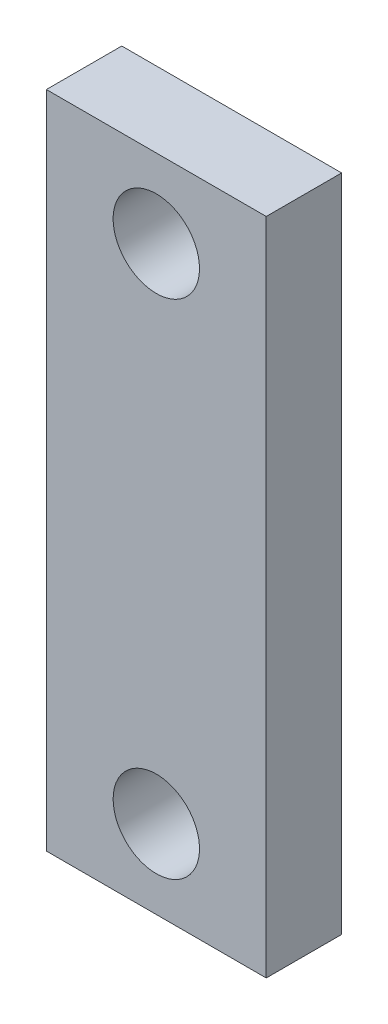
ISO-10303-21;
HEADER;
FILE_DESCRIPTION(('STEP AP214'),'2;1');
FILE_NAME('part.step','',(''),(''),'','','');
FILE_SCHEMA(('AUTOMOTIVE_DESIGN { 1 0 10303 214 1 1 1 1 }'));
ENDSEC;
DATA;
#1=APPLICATION_CONTEXT('core data for automotive mechanical design processes');
#2=APPLICATION_PROTOCOL_DEFINITION('international standard','automotive_design',2000,#1);
#3=PRODUCT_CONTEXT('',#1,'mechanical');
#4=PRODUCT('Part','Part','',(#3));
#5=PRODUCT_RELATED_PRODUCT_CATEGORY('part','',(#4));
#6=PRODUCT_DEFINITION_FORMATION('','',#4);
#7=PRODUCT_DEFINITION_CONTEXT('part definition',#1,'design');
#8=PRODUCT_DEFINITION('design','',#6,#7);
#9=PRODUCT_DEFINITION_SHAPE('','',#8);
#10=(LENGTH_UNIT() NAMED_UNIT(*) SI_UNIT(.MILLI.,.METRE.));
#11=(NAMED_UNIT(*) PLANE_ANGLE_UNIT() SI_UNIT($,.RADIAN.));
#12=(NAMED_UNIT(*) SI_UNIT($,.STERADIAN.) SOLID_ANGLE_UNIT());
#13=UNCERTAINTY_MEASURE_WITH_UNIT(LENGTH_MEASURE(1.E-05),#10,'distance_accuracy_value','');
#14=(GEOMETRIC_REPRESENTATION_CONTEXT(3) GLOBAL_UNCERTAINTY_ASSIGNED_CONTEXT((#13)) GLOBAL_UNIT_ASSIGNED_CONTEXT((#10,
#11,#12)) REPRESENTATION_CONTEXT('',''));
#15=CARTESIAN_POINT('',(0.,0.,0.));
#16=DIRECTION('',(0.,0.,1.));
#17=DIRECTION('',(1.,0.,0.));
#18=AXIS2_PLACEMENT_3D('',#15,#16,#17);
#19=CARTESIAN_POINT('',(0.,0.,4.8));
#20=DIRECTION('',(0.,0.,1.));
#21=DIRECTION('',(1.,0.,0.));
#22=AXIS2_PLACEMENT_3D('',#19,#20,#21);
#23=PLANE('',#22);
#24=CARTESIAN_POINT('',(0.,16.,4.8));
#25=DIRECTION('',(0.,0.,1.));
#26=DIRECTION('',(1.,0.,0.));
#27=AXIS2_PLACEMENT_3D('',#24,#25,#26);
#28=CIRCLE('',#27,2.75);
#29=CARTESIAN_POINT('',(2.75,16.,4.8));
#30=VERTEX_POINT('',#29);
#31=EDGE_CURVE('E118',#30,#30,#28,.T.);
#32=ORIENTED_EDGE('',*,*,#31,.F.);
#33=EDGE_LOOP('',(#32));
#34=FACE_BOUND('',#33,.T.);
#35=DIRECTION('',(0.,1.,0.));
#36=VECTOR('',#35,1.);
#37=CARTESIAN_POINT('',(7.,21.,4.8));
#38=LINE('',#37,#36);
#39=CARTESIAN_POINT('',(7.,-21.,4.8));
#40=VERTEX_POINT('',#39);
#41=CARTESIAN_POINT('',(7.,21.,4.8));
#42=VERTEX_POINT('',#41);
#43=EDGE_CURVE('E98',#40,#42,#38,.T.);
#44=ORIENTED_EDGE('',*,*,#43,.T.);
#45=DIRECTION('',(-1.,0.,0.));
#46=VECTOR('',#45,1.);
#47=CARTESIAN_POINT('',(-7.,21.,4.8));
#48=LINE('',#47,#46);
#49=CARTESIAN_POINT('',(-7.,21.,4.8));
#50=VERTEX_POINT('',#49);
#51=EDGE_CURVE('E93',#42,#50,#48,.T.);
#52=ORIENTED_EDGE('',*,*,#51,.T.);
#53=DIRECTION('',(0.,-1.,0.));
#54=VECTOR('',#53,1.);
#55=CARTESIAN_POINT('',(-7.,21.,4.8));
#56=LINE('',#55,#54);
#57=CARTESIAN_POINT('',(-7.,-21.,4.8));
#58=VERTEX_POINT('',#57);
#59=EDGE_CURVE('E96',#50,#58,#56,.T.);
#60=ORIENTED_EDGE('',*,*,#59,.T.);
#61=DIRECTION('',(1.,0.,0.));
#62=VECTOR('',#61,1.);
#63=CARTESIAN_POINT('',(-7.,-21.,4.8));
#64=LINE('',#63,#62);
#65=EDGE_CURVE('E63',#58,#40,#64,.T.);
#66=ORIENTED_EDGE('',*,*,#65,.T.);
#67=EDGE_LOOP('',(#44,#52,#60,#66));
#68=FACE_BOUND('',#67,.T.);
#69=CARTESIAN_POINT('',(0.,-16.,4.8));
#70=DIRECTION('',(0.,0.,1.));
#71=DIRECTION('',(-1.,0.,0.));
#72=AXIS2_PLACEMENT_3D('',#69,#70,#71);
#73=CIRCLE('',#72,2.75);
#74=CARTESIAN_POINT('',(-2.75,-16.,4.8));
#75=VERTEX_POINT('',#74);
#76=EDGE_CURVE('E140',#75,#75,#73,.T.);
#77=ORIENTED_EDGE('',*,*,#76,.F.);
#78=EDGE_LOOP('',(#77));
#79=FACE_BOUND('',#78,.T.);
#80=ADVANCED_FACE('F45',(#34,#68,#79),#23,.T.);
#81=CARTESIAN_POINT('',(0.,0.,0.));
#82=DIRECTION('',(0.,0.,1.));
#83=DIRECTION('',(1.,0.,0.));
#84=AXIS2_PLACEMENT_3D('',#81,#82,#83);
#85=PLANE('',#84);
#86=DIRECTION('',(0.,1.,0.));
#87=VECTOR('',#86,1.);
#88=CARTESIAN_POINT('',(7.,21.,0.));
#89=LINE('',#88,#87);
#90=CARTESIAN_POINT('',(7.,-21.,0.));
#91=VERTEX_POINT('',#90);
#92=CARTESIAN_POINT('',(7.,21.,0.));
#93=VERTEX_POINT('',#92);
#94=EDGE_CURVE('E114',#91,#93,#89,.T.);
#95=ORIENTED_EDGE('',*,*,#94,.F.);
#96=DIRECTION('',(1.,0.,0.));
#97=VECTOR('',#96,1.);
#98=CARTESIAN_POINT('',(-7.,-21.,0.));
#99=LINE('',#98,#97);
#100=CARTESIAN_POINT('',(-7.,-21.,0.));
#101=VERTEX_POINT('',#100);
#102=EDGE_CURVE('E86',#101,#91,#99,.T.);
#103=ORIENTED_EDGE('',*,*,#102,.F.);
#104=DIRECTION('',(0.,-1.,0.));
#105=VECTOR('',#104,1.);
#106=CARTESIAN_POINT('',(-7.,21.,0.));
#107=LINE('',#106,#105);
#108=CARTESIAN_POINT('',(-7.,21.,0.));
#109=VERTEX_POINT('',#108);
#110=EDGE_CURVE('E80',#109,#101,#107,.T.);
#111=ORIENTED_EDGE('',*,*,#110,.F.);
#112=DIRECTION('',(-1.,0.,0.));
#113=VECTOR('',#112,1.);
#114=CARTESIAN_POINT('',(-7.,21.,0.));
#115=LINE('',#114,#113);
#116=EDGE_CURVE('E103',#93,#109,#115,.T.);
#117=ORIENTED_EDGE('',*,*,#116,.F.);
#118=EDGE_LOOP('',(#95,#103,#111,#117));
#119=FACE_BOUND('',#118,.T.);
#120=CARTESIAN_POINT('',(0.,16.,0.));
#121=DIRECTION('',(0.,0.,1.));
#122=DIRECTION('',(1.,0.,0.));
#123=AXIS2_PLACEMENT_3D('',#120,#121,#122);
#124=CIRCLE('',#123,2.75);
#125=CARTESIAN_POINT('',(2.75,16.,0.));
#126=VERTEX_POINT('',#125);
#127=EDGE_CURVE('E136',#126,#126,#124,.T.);
#128=ORIENTED_EDGE('',*,*,#127,.T.);
#129=EDGE_LOOP('',(#128));
#130=FACE_BOUND('',#129,.T.);
#131=CARTESIAN_POINT('',(0.,-16.,0.));
#132=DIRECTION('',(0.,0.,1.));
#133=DIRECTION('',(-1.,0.,0.));
#134=AXIS2_PLACEMENT_3D('',#131,#132,#133);
#135=CIRCLE('',#134,2.75);
#136=CARTESIAN_POINT('',(-2.75,-16.,0.));
#137=VERTEX_POINT('',#136);
#138=EDGE_CURVE('E144',#137,#137,#135,.T.);
#139=ORIENTED_EDGE('',*,*,#138,.T.);
#140=EDGE_LOOP('',(#139));
#141=FACE_BOUND('',#140,.T.);
#142=ADVANCED_FACE('F131',(#119,#130,#141),#85,.F.);
#143=CARTESIAN_POINT('',(7.,21.,4.8));
#144=DIRECTION('',(-1.,0.,0.));
#145=DIRECTION('',(0.,-1.,0.));
#146=AXIS2_PLACEMENT_3D('',#143,#144,#145);
#147=PLANE('',#146);
#148=ORIENTED_EDGE('',*,*,#94,.T.);
#149=DIRECTION('',(0.,0.,-1.));
#150=VECTOR('',#149,1.);
#151=CARTESIAN_POINT('',(7.,21.,4.8));
#152=LINE('',#151,#150);
#153=EDGE_CURVE('E11',#42,#93,#152,.T.);
#154=ORIENTED_EDGE('',*,*,#153,.F.);
#155=ORIENTED_EDGE('',*,*,#43,.F.);
#156=DIRECTION('',(0.,0.,-1.));
#157=VECTOR('',#156,1.);
#158=CARTESIAN_POINT('',(7.,-21.,4.8));
#159=LINE('',#158,#157);
#160=EDGE_CURVE('E110',#40,#91,#159,.T.);
#161=ORIENTED_EDGE('',*,*,#160,.T.);
#162=EDGE_LOOP('',(#148,#154,#155,#161));
#163=FACE_BOUND('',#162,.T.);
#164=ADVANCED_FACE('F47',(#163),#147,.F.);
#165=CARTESIAN_POINT('',(-7.,21.,4.8));
#166=DIRECTION('',(0.,-1.,0.));
#167=DIRECTION('',(0.,0.,-1.));
#168=AXIS2_PLACEMENT_3D('',#165,#166,#167);
#169=PLANE('',#168);
#170=ORIENTED_EDGE('',*,*,#116,.T.);
#171=DIRECTION('',(0.,0.,-1.));
#172=VECTOR('',#171,1.);
#173=CARTESIAN_POINT('',(-7.,21.,4.8));
#174=LINE('',#173,#172);
#175=EDGE_CURVE('E55',#50,#109,#174,.T.);
#176=ORIENTED_EDGE('',*,*,#175,.F.);
#177=ORIENTED_EDGE('',*,*,#51,.F.);
#178=ORIENTED_EDGE('',*,*,#153,.T.);
#179=EDGE_LOOP('',(#170,#176,#177,#178));
#180=FACE_BOUND('',#179,.T.);
#181=ADVANCED_FACE('F102',(#180),#169,.F.);
#182=CARTESIAN_POINT('',(-7.,21.,4.8));
#183=DIRECTION('',(1.,0.,0.));
#184=DIRECTION('',(0.,1.,0.));
#185=AXIS2_PLACEMENT_3D('',#182,#183,#184);
#186=PLANE('',#185);
#187=ORIENTED_EDGE('',*,*,#110,.T.);
#188=DIRECTION('',(0.,0.,-1.));
#189=VECTOR('',#188,1.);
#190=CARTESIAN_POINT('',(-7.,-21.,4.8));
#191=LINE('',#190,#189);
#192=EDGE_CURVE('E105',#58,#101,#191,.T.);
#193=ORIENTED_EDGE('',*,*,#192,.F.);
#194=ORIENTED_EDGE('',*,*,#59,.F.);
#195=ORIENTED_EDGE('',*,*,#175,.T.);
#196=EDGE_LOOP('',(#187,#193,#194,#195));
#197=FACE_BOUND('',#196,.T.);
#198=ADVANCED_FACE('F106',(#197),#186,.F.);
#199=CARTESIAN_POINT('',(-7.,-21.,4.8));
#200=DIRECTION('',(0.,1.,0.));
#201=DIRECTION('',(0.,0.,1.));
#202=AXIS2_PLACEMENT_3D('',#199,#200,#201);
#203=PLANE('',#202);
#204=ORIENTED_EDGE('',*,*,#102,.T.);
#205=ORIENTED_EDGE('',*,*,#160,.F.);
#206=ORIENTED_EDGE('',*,*,#65,.F.);
#207=ORIENTED_EDGE('',*,*,#192,.T.);
#208=EDGE_LOOP('',(#204,#205,#206,#207));
#209=FACE_BOUND('',#208,.T.);
#210=ADVANCED_FACE('F128',(#209),#203,.F.);
#211=CARTESIAN_POINT('',(0.,16.,4.8));
#212=DIRECTION('',(0.,0.,-1.));
#213=DIRECTION('',(-1.,0.,0.));
#214=AXIS2_PLACEMENT_3D('',#211,#212,#213);
#215=CYLINDRICAL_SURFACE('',#214,2.75);
#216=ORIENTED_EDGE('',*,*,#31,.T.);
#217=EDGE_LOOP('',(#216));
#218=FACE_BOUND('',#217,.T.);
#219=ORIENTED_EDGE('',*,*,#127,.F.);
#220=EDGE_LOOP('',(#219));
#221=FACE_BOUND('',#220,.T.);
#222=ADVANCED_FACE('F163',(#218,#221),#215,.F.);
#223=CARTESIAN_POINT('',(0.,-16.,4.8));
#224=DIRECTION('',(0.,0.,-1.));
#225=DIRECTION('',(-1.,0.,0.));
#226=AXIS2_PLACEMENT_3D('',#223,#224,#225);
#227=CYLINDRICAL_SURFACE('',#226,2.75);
#228=ORIENTED_EDGE('',*,*,#76,.T.);
#229=EDGE_LOOP('',(#228));
#230=FACE_BOUND('',#229,.T.);
#231=ORIENTED_EDGE('',*,*,#138,.F.);
#232=EDGE_LOOP('',(#231));
#233=FACE_BOUND('',#232,.T.);
#234=ADVANCED_FACE('F152',(#230,#233),#227,.F.);
#235=CLOSED_SHELL('',(#80,#142,#164,#181,#198,#210,#222,#234));
#236=MANIFOLD_SOLID_BREP('B2',#235);
#237=ADVANCED_BREP_SHAPE_REPRESENTATION('',(#18,#236),#14);
#238=SHAPE_DEFINITION_REPRESENTATION(#9,#237);
ENDSEC;
END-ISO-10303-21;
